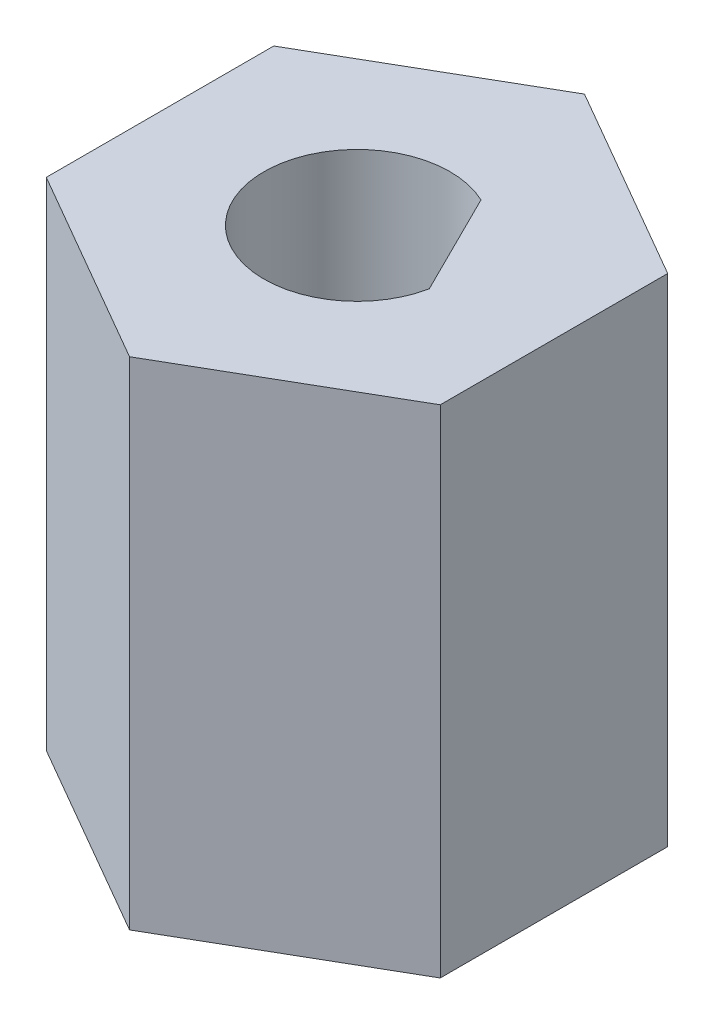
ISO-10303-21;
HEADER;
FILE_DESCRIPTION(('STEP AP214'),'2;1');
FILE_NAME('part.step','',(''),(''),'','','');
FILE_SCHEMA(('AUTOMOTIVE_DESIGN { 1 0 10303 214 1 1 1 1 }'));
ENDSEC;
DATA;
#1=APPLICATION_CONTEXT('core data for automotive mechanical design processes');
#2=APPLICATION_PROTOCOL_DEFINITION('international standard','automotive_design',2000,#1);
#3=PRODUCT_CONTEXT('',#1,'mechanical');
#4=PRODUCT('Part','Part','',(#3));
#5=PRODUCT_RELATED_PRODUCT_CATEGORY('part','',(#4));
#6=PRODUCT_DEFINITION_FORMATION('','',#4);
#7=PRODUCT_DEFINITION_CONTEXT('part definition',#1,'design');
#8=PRODUCT_DEFINITION('design','',#6,#7);
#9=PRODUCT_DEFINITION_SHAPE('','',#8);
#10=(LENGTH_UNIT() NAMED_UNIT(*) SI_UNIT(.MILLI.,.METRE.));
#11=(NAMED_UNIT(*) PLANE_ANGLE_UNIT() SI_UNIT($,.RADIAN.));
#12=(NAMED_UNIT(*) SI_UNIT($,.STERADIAN.) SOLID_ANGLE_UNIT());
#13=UNCERTAINTY_MEASURE_WITH_UNIT(LENGTH_MEASURE(1.E-05),#10,'distance_accuracy_value','');
#14=(GEOMETRIC_REPRESENTATION_CONTEXT(3) GLOBAL_UNCERTAINTY_ASSIGNED_CONTEXT((#13)) GLOBAL_UNIT_ASSIGNED_CONTEXT((#10,
#11,#12)) REPRESENTATION_CONTEXT('',''));
#15=CARTESIAN_POINT('',(0.,0.,0.));
#16=DIRECTION('',(0.,0.,1.));
#17=DIRECTION('',(1.,0.,0.));
#18=AXIS2_PLACEMENT_3D('',#15,#16,#17);
#19=CARTESIAN_POINT('',(-6.34999999999995,16.002,3.66617420935419));
#20=DIRECTION('',(0.499999999999995,0.,-0.866025403784441));
#21=DIRECTION('',(-0.866025403784442,0.,-0.499999999999995));
#22=AXIS2_PLACEMENT_3D('',#19,#20,#21);
#23=PLANE('',#22);
#24=DIRECTION('',(0.866025403784441,0.,0.499999999999995));
#25=VECTOR('',#24,1.);
#26=CARTESIAN_POINT('',(-6.34999999999995,0.,3.66617420935419));
#27=LINE('',#26,#25);
#28=CARTESIAN_POINT('',(-6.34999999999995,0.,3.66617420935419));
#29=VERTEX_POINT('',#28);
#30=CARTESIAN_POINT('',(0.,0.,7.33234841870824));
#31=VERTEX_POINT('',#30);
#32=EDGE_CURVE('E112',#29,#31,#27,.T.);
#33=ORIENTED_EDGE('',*,*,#32,.T.);
#34=DIRECTION('',(0.,-1.,0.));
#35=VECTOR('',#34,1.);
#36=CARTESIAN_POINT('',(0.,16.002,7.33234841870824));
#37=LINE('',#36,#35);
#38=CARTESIAN_POINT('',(0.,16.002,7.33234841870824));
#39=VERTEX_POINT('',#38);
#40=EDGE_CURVE('E96',#39,#31,#37,.T.);
#41=ORIENTED_EDGE('',*,*,#40,.F.);
#42=DIRECTION('',(0.866025403784441,0.,0.499999999999995));
#43=VECTOR('',#42,1.);
#44=CARTESIAN_POINT('',(-6.34999999999995,16.002,3.66617420935419));
#45=LINE('',#44,#43);
#46=CARTESIAN_POINT('',(-6.34999999999995,16.002,3.66617420935419));
#47=VERTEX_POINT('',#46);
#48=EDGE_CURVE('E135',#47,#39,#45,.T.);
#49=ORIENTED_EDGE('',*,*,#48,.F.);
#50=DIRECTION('',(0.,-1.,0.));
#51=VECTOR('',#50,1.);
#52=CARTESIAN_POINT('',(-6.34999999999995,16.002,3.66617420935419));
#53=LINE('',#52,#51);
#54=EDGE_CURVE('E136',#47,#29,#53,.T.);
#55=ORIENTED_EDGE('',*,*,#54,.T.);
#56=EDGE_LOOP('',(#33,#41,#49,#55));
#57=FACE_BOUND('',#56,.T.);
#58=ADVANCED_FACE('F33',(#57),#23,.F.);
#59=CARTESIAN_POINT('',(0.,16.002,7.33234841870824));
#60=DIRECTION('',(-0.500000000000001,0.,-0.866025403784438));
#61=DIRECTION('',(-0.866025403784438,0.,0.500000000000001));
#62=AXIS2_PLACEMENT_3D('',#59,#60,#61);
#63=PLANE('',#62);
#64=DIRECTION('',(0.866025403784438,0.,-0.500000000000001));
#65=VECTOR('',#64,1.);
#66=CARTESIAN_POINT('',(0.,0.,7.33234841870824));
#67=LINE('',#66,#65);
#68=CARTESIAN_POINT('',(6.35,0.,3.6661742093541));
#69=VERTEX_POINT('',#68);
#70=EDGE_CURVE('E116',#31,#69,#67,.T.);
#71=ORIENTED_EDGE('',*,*,#70,.T.);
#72=DIRECTION('',(0.,-1.,0.));
#73=VECTOR('',#72,1.);
#74=CARTESIAN_POINT('',(6.35,16.002,3.6661742093541));
#75=LINE('',#74,#73);
#76=CARTESIAN_POINT('',(6.35,16.002,3.6661742093541));
#77=VERTEX_POINT('',#76);
#78=EDGE_CURVE('E147',#77,#69,#75,.T.);
#79=ORIENTED_EDGE('',*,*,#78,.F.);
#80=DIRECTION('',(0.866025403784438,0.,-0.500000000000001));
#81=VECTOR('',#80,1.);
#82=CARTESIAN_POINT('',(0.,16.002,7.33234841870824));
#83=LINE('',#82,#81);
#84=EDGE_CURVE('E153',#39,#77,#83,.T.);
#85=ORIENTED_EDGE('',*,*,#84,.F.);
#86=ORIENTED_EDGE('',*,*,#40,.T.);
#87=EDGE_LOOP('',(#71,#79,#85,#86));
#88=FACE_BOUND('',#87,.T.);
#89=ADVANCED_FACE('F151',(#88),#63,.F.);
#90=CARTESIAN_POINT('',(6.35,16.002,3.6661742093541));
#91=DIRECTION('',(-1.,0.,0.));
#92=DIRECTION('',(0.,0.,1.));
#93=AXIS2_PLACEMENT_3D('',#90,#91,#92);
#94=PLANE('',#93);
#95=DIRECTION('',(0.,0.,-1.));
#96=VECTOR('',#95,1.);
#97=CARTESIAN_POINT('',(6.35,0.,3.6661742093541));
#98=LINE('',#97,#96);
#99=CARTESIAN_POINT('',(6.34999999999997,0.,-3.66617420935415));
#100=VERTEX_POINT('',#99);
#101=EDGE_CURVE('E122',#69,#100,#98,.T.);
#102=ORIENTED_EDGE('',*,*,#101,.T.);
#103=DIRECTION('',(0.,-1.,0.));
#104=VECTOR('',#103,1.);
#105=CARTESIAN_POINT('',(6.34999999999997,16.002,-3.66617420935415));
#106=LINE('',#105,#104);
#107=CARTESIAN_POINT('',(6.34999999999997,16.002,-3.66617420935415));
#108=VERTEX_POINT('',#107);
#109=EDGE_CURVE('E144',#108,#100,#106,.T.);
#110=ORIENTED_EDGE('',*,*,#109,.F.);
#111=DIRECTION('',(0.,0.,-1.));
#112=VECTOR('',#111,1.);
#113=CARTESIAN_POINT('',(6.35,16.002,3.6661742093541));
#114=LINE('',#113,#112);
#115=EDGE_CURVE('E159',#77,#108,#114,.T.);
#116=ORIENTED_EDGE('',*,*,#115,.F.);
#117=ORIENTED_EDGE('',*,*,#78,.T.);
#118=EDGE_LOOP('',(#102,#110,#116,#117));
#119=FACE_BOUND('',#118,.T.);
#120=ADVANCED_FACE('F181',(#119),#94,.F.);
#121=CARTESIAN_POINT('',(6.34999999999997,16.002,-3.66617420935415));
#122=DIRECTION('',(-0.499999999999995,0.,0.866025403784442));
#123=DIRECTION('',(0.866025403784442,0.,0.499999999999995));
#124=AXIS2_PLACEMENT_3D('',#121,#122,#123);
#125=PLANE('',#124);
#126=DIRECTION('',(-0.866025403784442,0.,-0.499999999999995));
#127=VECTOR('',#126,1.);
#128=CARTESIAN_POINT('',(6.34999999999997,0.,-3.66617420935415));
#129=LINE('',#128,#127);
#130=CARTESIAN_POINT('',(0.,0.,-7.33234841870824));
#131=VERTEX_POINT('',#130);
#132=EDGE_CURVE('E130',#100,#131,#129,.T.);
#133=ORIENTED_EDGE('',*,*,#132,.T.);
#134=DIRECTION('',(0.,-1.,0.));
#135=VECTOR('',#134,1.);
#136=CARTESIAN_POINT('',(0.,16.002,-7.33234841870824));
#137=LINE('',#136,#135);
#138=CARTESIAN_POINT('',(0.,16.002,-7.33234841870824));
#139=VERTEX_POINT('',#138);
#140=EDGE_CURVE('E141',#139,#131,#137,.T.);
#141=ORIENTED_EDGE('',*,*,#140,.F.);
#142=DIRECTION('',(-0.866025403784442,0.,-0.499999999999995));
#143=VECTOR('',#142,1.);
#144=CARTESIAN_POINT('',(6.34999999999997,16.002,-3.66617420935415));
#145=LINE('',#144,#143);
#146=EDGE_CURVE('E164',#108,#139,#145,.T.);
#147=ORIENTED_EDGE('',*,*,#146,.F.);
#148=ORIENTED_EDGE('',*,*,#109,.T.);
#149=EDGE_LOOP('',(#133,#141,#147,#148));
#150=FACE_BOUND('',#149,.T.);
#151=ADVANCED_FACE('F176',(#150),#125,.F.);
#152=CARTESIAN_POINT('',(0.,16.002,-7.33234841870824));
#153=DIRECTION('',(0.500000000000007,0.,0.866025403784435));
#154=DIRECTION('',(0.866025403784435,0.,-0.500000000000007));
#155=AXIS2_PLACEMENT_3D('',#152,#153,#154);
#156=PLANE('',#155);
#157=DIRECTION('',(-0.866025403784435,0.,0.500000000000007));
#158=VECTOR('',#157,1.);
#159=CARTESIAN_POINT('',(0.,0.,-7.33234841870824));
#160=LINE('',#159,#158);
#161=CARTESIAN_POINT('',(-6.35000000000003,0.,-3.66617420935406));
#162=VERTEX_POINT('',#161);
#163=EDGE_CURVE('E132',#131,#162,#160,.T.);
#164=ORIENTED_EDGE('',*,*,#163,.T.);
#165=DIRECTION('',(0.,-1.,0.));
#166=VECTOR('',#165,1.);
#167=CARTESIAN_POINT('',(-6.35000000000003,16.002,-3.66617420935406));
#168=LINE('',#167,#166);
#169=CARTESIAN_POINT('',(-6.35000000000003,16.002,-3.66617420935406));
#170=VERTEX_POINT('',#169);
#171=EDGE_CURVE('E138',#170,#162,#168,.T.);
#172=ORIENTED_EDGE('',*,*,#171,.F.);
#173=DIRECTION('',(-0.866025403784435,0.,0.500000000000007));
#174=VECTOR('',#173,1.);
#175=CARTESIAN_POINT('',(0.,16.002,-7.33234841870824));
#176=LINE('',#175,#174);
#177=EDGE_CURVE('E165',#139,#170,#176,.T.);
#178=ORIENTED_EDGE('',*,*,#177,.F.);
#179=ORIENTED_EDGE('',*,*,#140,.T.);
#180=EDGE_LOOP('',(#164,#172,#178,#179));
#181=FACE_BOUND('',#180,.T.);
#182=ADVANCED_FACE('F172',(#181),#156,.F.);
#183=CARTESIAN_POINT('',(-6.35000000000003,16.002,-3.66617420935406));
#184=DIRECTION('',(1.,0.,0.));
#185=DIRECTION('',(0.,0.,-1.));
#186=AXIS2_PLACEMENT_3D('',#183,#184,#185);
#187=PLANE('',#186);
#188=DIRECTION('',(0.,0.,1.));
#189=VECTOR('',#188,1.);
#190=CARTESIAN_POINT('',(-6.35000000000003,0.,-3.66617420935406));
#191=LINE('',#190,#189);
#192=EDGE_CURVE('E114',#162,#29,#191,.T.);
#193=ORIENTED_EDGE('',*,*,#192,.T.);
#194=ORIENTED_EDGE('',*,*,#54,.F.);
#195=DIRECTION('',(0.,0.,1.));
#196=VECTOR('',#195,1.);
#197=CARTESIAN_POINT('',(-6.35000000000003,16.002,-3.66617420935406));
#198=LINE('',#197,#196);
#199=EDGE_CURVE('E126',#170,#47,#198,.T.);
#200=ORIENTED_EDGE('',*,*,#199,.F.);
#201=ORIENTED_EDGE('',*,*,#171,.T.);
#202=EDGE_LOOP('',(#193,#194,#200,#201));
#203=FACE_BOUND('',#202,.T.);
#204=ADVANCED_FACE('F170',(#203),#187,.F.);
#205=CARTESIAN_POINT('',(0.,16.002,0.));
#206=DIRECTION('',(0.,1.,0.));
#207=DIRECTION('',(0.,0.,1.));
#208=AXIS2_PLACEMENT_3D('',#205,#206,#207);
#209=PLANE('',#208);
#210=CARTESIAN_POINT('',(0.,16.002,0.));
#211=DIRECTION('',(0.,1.,0.));
#212=DIRECTION('',(0.,0.,1.));
#213=AXIS2_PLACEMENT_3D('',#210,#211,#212);
#214=CIRCLE('',#213,3.);
#215=CARTESIAN_POINT('',(2.93738820114201,16.002,0.609713503041979));
#216=VERTEX_POINT('',#215);
#217=CARTESIAN_POINT('',(1.28621425291707,16.002,-2.71028649695802));
#218=VERTEX_POINT('',#217);
#219=EDGE_CURVE('E102',#216,#218,#214,.F.);
#220=ORIENTED_EDGE('',*,*,#219,.T.);
#221=DIRECTION('',(0.445308329826591,0.,0.895377289966108));
#222=VECTOR('',#221,1.);
#223=CARTESIAN_POINT('',(2.11180122702954,16.002,-1.05028649695802));
#224=LINE('',#223,#222);
#225=EDGE_CURVE('E100',#218,#216,#224,.T.);
#226=ORIENTED_EDGE('',*,*,#225,.T.);
#227=EDGE_LOOP('',(#220,#226));
#228=FACE_BOUND('',#227,.T.);
#229=ORIENTED_EDGE('',*,*,#48,.T.);
#230=ORIENTED_EDGE('',*,*,#84,.T.);
#231=ORIENTED_EDGE('',*,*,#115,.T.);
#232=ORIENTED_EDGE('',*,*,#146,.T.);
#233=ORIENTED_EDGE('',*,*,#177,.T.);
#234=ORIENTED_EDGE('',*,*,#199,.T.);
#235=EDGE_LOOP('',(#229,#230,#231,#232,#233,#234));
#236=FACE_BOUND('',#235,.T.);
#237=ADVANCED_FACE('F107',(#228,#236),#209,.T.);
#238=CARTESIAN_POINT('',(0.,0.,0.));
#239=DIRECTION('',(0.,1.,0.));
#240=DIRECTION('',(0.,0.,1.));
#241=AXIS2_PLACEMENT_3D('',#238,#239,#240);
#242=PLANE('',#241);
#243=DIRECTION('',(0.445308329826591,0.,0.895377289966108));
#244=VECTOR('',#243,1.);
#245=CARTESIAN_POINT('',(2.11180122702954,0.,-1.05028649695802));
#246=LINE('',#245,#244);
#247=CARTESIAN_POINT('',(1.28621425291707,0.,-2.71028649695802));
#248=VERTEX_POINT('',#247);
#249=CARTESIAN_POINT('',(2.93738820114201,0.,0.609713503041979));
#250=VERTEX_POINT('',#249);
#251=EDGE_CURVE('E11',#248,#250,#246,.T.);
#252=ORIENTED_EDGE('',*,*,#251,.F.);
#253=CARTESIAN_POINT('',(0.,0.,0.));
#254=DIRECTION('',(0.,1.,0.));
#255=DIRECTION('',(0.,0.,1.));
#256=AXIS2_PLACEMENT_3D('',#253,#254,#255);
#257=CIRCLE('',#256,3.);
#258=EDGE_CURVE('E40',#250,#248,#257,.F.);
#259=ORIENTED_EDGE('',*,*,#258,.F.);
#260=EDGE_LOOP('',(#252,#259));
#261=FACE_BOUND('',#260,.T.);
#262=ORIENTED_EDGE('',*,*,#32,.F.);
#263=ORIENTED_EDGE('',*,*,#192,.F.);
#264=ORIENTED_EDGE('',*,*,#163,.F.);
#265=ORIENTED_EDGE('',*,*,#132,.F.);
#266=ORIENTED_EDGE('',*,*,#101,.F.);
#267=ORIENTED_EDGE('',*,*,#70,.F.);
#268=EDGE_LOOP('',(#262,#263,#264,#265,#266,#267));
#269=FACE_BOUND('',#268,.T.);
#270=ADVANCED_FACE('F104',(#261,#269),#242,.F.);
#271=CARTESIAN_POINT('',(2.11180122702954,19.177,-1.05028649695802));
#272=DIRECTION('',(-0.895377289966108,0.,0.445308329826591));
#273=DIRECTION('',(0.445308329826591,0.,0.895377289966108));
#274=AXIS2_PLACEMENT_3D('',#271,#272,#273);
#275=PLANE('',#274);
#276=DIRECTION('',(0.,-1.,0.));
#277=VECTOR('',#276,1.);
#278=CARTESIAN_POINT('',(1.28621425291707,19.177,-2.71028649695802));
#279=LINE('',#278,#277);
#280=EDGE_CURVE('E47',#218,#248,#279,.T.);
#281=ORIENTED_EDGE('',*,*,#280,.T.);
#282=ORIENTED_EDGE('',*,*,#251,.T.);
#283=DIRECTION('',(0.,-1.,0.));
#284=VECTOR('',#283,1.);
#285=CARTESIAN_POINT('',(2.93738820114201,19.177,0.609713503041979));
#286=LINE('',#285,#284);
#287=EDGE_CURVE('E52',#216,#250,#286,.T.);
#288=ORIENTED_EDGE('',*,*,#287,.F.);
#289=ORIENTED_EDGE('',*,*,#225,.F.);
#290=EDGE_LOOP('',(#281,#282,#288,#289));
#291=FACE_BOUND('',#290,.T.);
#292=ADVANCED_FACE('F98',(#291),#275,.T.);
#293=CARTESIAN_POINT('',(0.,19.177,0.));
#294=DIRECTION('',(0.,-1.,0.));
#295=DIRECTION('',(0.,0.,-1.));
#296=AXIS2_PLACEMENT_3D('',#293,#294,#295);
#297=CYLINDRICAL_SURFACE('',#296,3.);
#298=ORIENTED_EDGE('',*,*,#287,.T.);
#299=ORIENTED_EDGE('',*,*,#258,.T.);
#300=ORIENTED_EDGE('',*,*,#280,.F.);
#301=ORIENTED_EDGE('',*,*,#219,.F.);
#302=EDGE_LOOP('',(#298,#299,#300,#301));
#303=FACE_BOUND('',#302,.T.);
#304=ADVANCED_FACE('F93',(#303),#297,.F.);
#305=CLOSED_SHELL('',(#58,#89,#120,#151,#182,#204,#237,#270,#292,#304));
#306=MANIFOLD_SOLID_BREP('B2',#305);
#307=ADVANCED_BREP_SHAPE_REPRESENTATION('',(#18,#306),#14);
#308=SHAPE_DEFINITION_REPRESENTATION(#9,#307);
ENDSEC;
END-ISO-10303-21;
